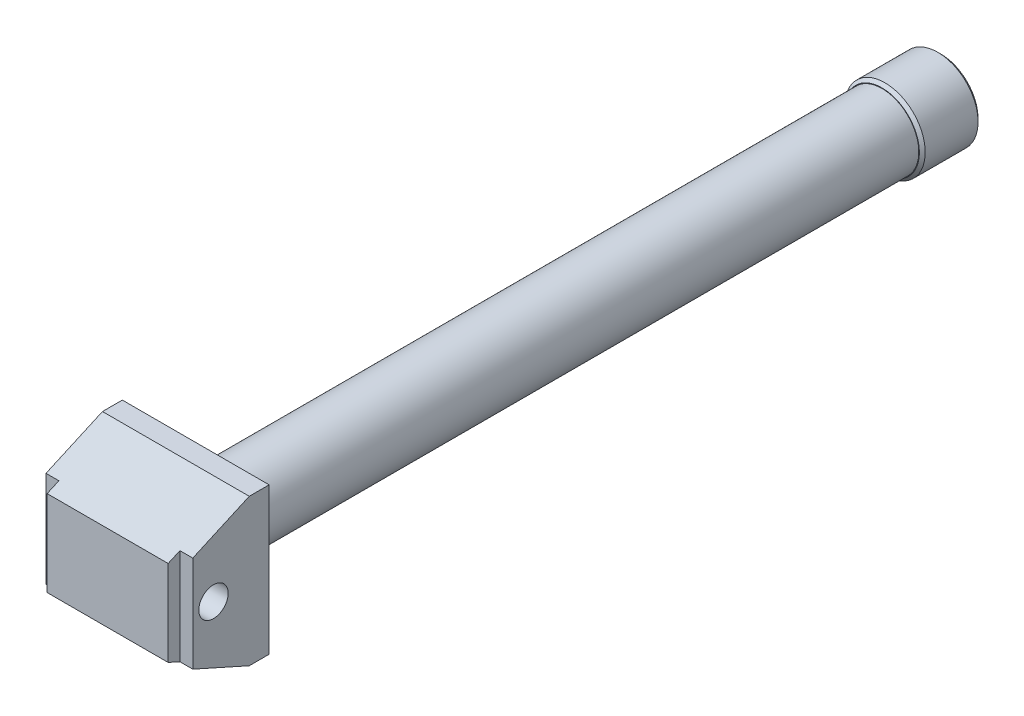
ISO-10303-21;
HEADER;
FILE_DESCRIPTION(('STEP AP214'),'2;1');
FILE_NAME('part.step','',(''),(''),'','','');
FILE_SCHEMA(('AUTOMOTIVE_DESIGN { 1 0 10303 214 1 1 1 1 }'));
ENDSEC;
DATA;
#1=APPLICATION_CONTEXT('core data for automotive mechanical design processes');
#2=APPLICATION_PROTOCOL_DEFINITION('international standard','automotive_design',2000,#1);
#3=PRODUCT_CONTEXT('',#1,'mechanical');
#4=PRODUCT('Part','Part','',(#3));
#5=PRODUCT_RELATED_PRODUCT_CATEGORY('part','',(#4));
#6=PRODUCT_DEFINITION_FORMATION('','',#4);
#7=PRODUCT_DEFINITION_CONTEXT('part definition',#1,'design');
#8=PRODUCT_DEFINITION('design','',#6,#7);
#9=PRODUCT_DEFINITION_SHAPE('','',#8);
#10=(LENGTH_UNIT() NAMED_UNIT(*) SI_UNIT(.MILLI.,.METRE.));
#11=(NAMED_UNIT(*) PLANE_ANGLE_UNIT() SI_UNIT($,.RADIAN.));
#12=(NAMED_UNIT(*) SI_UNIT($,.STERADIAN.) SOLID_ANGLE_UNIT());
#13=UNCERTAINTY_MEASURE_WITH_UNIT(LENGTH_MEASURE(1.E-05),#10,'distance_accuracy_value','');
#14=(GEOMETRIC_REPRESENTATION_CONTEXT(3) GLOBAL_UNCERTAINTY_ASSIGNED_CONTEXT((#13)) GLOBAL_UNIT_ASSIGNED_CONTEXT((#10,
#11,#12)) REPRESENTATION_CONTEXT('',''));
#15=CARTESIAN_POINT('',(0.,0.,0.));
#16=DIRECTION('',(0.,0.,1.));
#17=DIRECTION('',(1.,0.,0.));
#18=AXIS2_PLACEMENT_3D('',#15,#16,#17);
#19=CARTESIAN_POINT('',(0.,0.,-1169.));
#20=DIRECTION('',(0.,0.,-1.));
#21=DIRECTION('',(-1.,0.,0.));
#22=AXIS2_PLACEMENT_3D('',#19,#20,#21);
#23=CYLINDRICAL_SURFACE('',#22,68.445);
#24=CARTESIAN_POINT('',(0.,0.,-1174.));
#25=DIRECTION('',(0.,0.,-1.));
#26=DIRECTION('',(-1.,0.,0.));
#27=AXIS2_PLACEMENT_3D('',#24,#25,#26);
#28=CIRCLE('',#27,68.445);
#29=CARTESIAN_POINT('',(-68.445,0.,-1174.));
#30=VERTEX_POINT('',#29);
#31=EDGE_CURVE('E67',#30,#30,#28,.T.);
#32=ORIENTED_EDGE('',*,*,#31,.T.);
#33=EDGE_LOOP('',(#32));
#34=FACE_BOUND('',#33,.T.);
#35=CARTESIAN_POINT('',(0.,0.,-1264.));
#36=DIRECTION('',(0.,0.,-1.));
#37=DIRECTION('',(-1.,0.,0.));
#38=AXIS2_PLACEMENT_3D('',#35,#36,#37);
#39=CIRCLE('',#38,68.445);
#40=CARTESIAN_POINT('',(-68.445,0.,-1264.));
#41=VERTEX_POINT('',#40);
#42=EDGE_CURVE('E71',#41,#41,#39,.F.);
#43=ORIENTED_EDGE('',*,*,#42,.T.);
#44=EDGE_LOOP('',(#43));
#45=FACE_BOUND('',#44,.T.);
#46=ADVANCED_FACE('F55',(#34,#45),#23,.T.);
#47=CARTESIAN_POINT('',(0.,0.,-1169.));
#48=DIRECTION('',(0.,0.,-1.));
#49=DIRECTION('',(-1.,0.,0.));
#50=AXIS2_PLACEMENT_3D('',#47,#48,#49);
#51=PLANE('',#50);
#52=CARTESIAN_POINT('',(0.,0.,-1169.));
#53=DIRECTION('',(0.,0.,-1.));
#54=DIRECTION('',(-1.,0.,0.));
#55=AXIS2_PLACEMENT_3D('',#52,#53,#54);
#56=CIRCLE('',#55,63.445);
#57=CARTESIAN_POINT('',(-63.445,0.,-1169.));
#58=VERTEX_POINT('',#57);
#59=EDGE_CURVE('E63',#58,#58,#56,.F.);
#60=ORIENTED_EDGE('',*,*,#59,.T.);
#61=EDGE_LOOP('',(#60));
#62=FACE_BOUND('',#61,.T.);
#63=CARTESIAN_POINT('',(0.,0.,-1169.));
#64=DIRECTION('',(0.,0.,-1.));
#65=DIRECTION('',(-1.,0.,0.));
#66=AXIS2_PLACEMENT_3D('',#63,#64,#65);
#67=CIRCLE('',#66,62.5);
#68=CARTESIAN_POINT('',(-62.5,0.,-1169.));
#69=VERTEX_POINT('',#68);
#70=EDGE_CURVE('E76',#69,#69,#67,.T.);
#71=ORIENTED_EDGE('',*,*,#70,.T.);
#72=EDGE_LOOP('',(#71));
#73=FACE_BOUND('',#72,.T.);
#74=ADVANCED_FACE('F83',(#62,#73),#51,.F.);
#75=CARTESIAN_POINT('',(0.,0.,-1269.));
#76=DIRECTION('',(0.,0.,-1.));
#77=DIRECTION('',(-1.,0.,0.));
#78=AXIS2_PLACEMENT_3D('',#75,#76,#77);
#79=PLANE('',#78);
#80=CARTESIAN_POINT('',(0.,0.,-1269.));
#81=DIRECTION('',(0.,0.,-1.));
#82=DIRECTION('',(-1.,0.,0.));
#83=AXIS2_PLACEMENT_3D('',#80,#81,#82);
#84=CIRCLE('',#83,63.4450000000002);
#85=CARTESIAN_POINT('',(-63.4450000000002,0.,-1269.));
#86=VERTEX_POINT('',#85);
#87=EDGE_CURVE('E11',#86,#86,#84,.T.);
#88=ORIENTED_EDGE('',*,*,#87,.T.);
#89=EDGE_LOOP('',(#88));
#90=FACE_BOUND('',#89,.T.);
#91=CARTESIAN_POINT('',(0.,0.,-1269.));
#92=DIRECTION('',(0.,0.,-1.));
#93=DIRECTION('',(-1.,0.,0.));
#94=AXIS2_PLACEMENT_3D('',#91,#92,#93);
#95=CIRCLE('',#94,62.5);
#96=CARTESIAN_POINT('',(-62.5,0.,-1269.));
#97=VERTEX_POINT('',#96);
#98=EDGE_CURVE('E77',#97,#97,#95,.T.);
#99=ORIENTED_EDGE('',*,*,#98,.F.);
#100=EDGE_LOOP('',(#99));
#101=FACE_BOUND('',#100,.T.);
#102=ADVANCED_FACE('F89',(#90,#101),#79,.T.);
#103=CARTESIAN_POINT('',(0.,0.,-1169.));
#104=DIRECTION('',(0.,0.,-1.));
#105=DIRECTION('',(-1.,0.,0.));
#106=AXIS2_PLACEMENT_3D('',#103,#104,#105);
#107=CYLINDRICAL_SURFACE('',#106,62.5);
#108=ORIENTED_EDGE('',*,*,#70,.F.);
#109=EDGE_LOOP('',(#108));
#110=FACE_BOUND('',#109,.T.);
#111=ORIENTED_EDGE('',*,*,#98,.T.);
#112=EDGE_LOOP('',(#111));
#113=FACE_BOUND('',#112,.T.);
#114=ADVANCED_FACE('F85',(#110,#113),#107,.F.);
#115=CARTESIAN_POINT('',(0.,0.,-1174.));
#116=DIRECTION('',(0.,0.,-1.));
#117=DIRECTION('',(-1.,0.,0.));
#118=AXIS2_PLACEMENT_3D('',#115,#116,#117);
#119=CONICAL_SURFACE('',#118,68.445,0.785398163397432);
#120=ORIENTED_EDGE('',*,*,#59,.F.);
#121=EDGE_LOOP('',(#120));
#122=FACE_BOUND('',#121,.T.);
#123=ORIENTED_EDGE('',*,*,#31,.F.);
#124=EDGE_LOOP('',(#123));
#125=FACE_BOUND('',#124,.T.);
#126=ADVANCED_FACE('F88',(#122,#125),#119,.T.);
#127=CARTESIAN_POINT('',(0.,0.,-1269.));
#128=DIRECTION('',(0.,0.,1.));
#129=DIRECTION('',(1.,0.,0.));
#130=AXIS2_PLACEMENT_3D('',#127,#128,#129);
#131=CONICAL_SURFACE('',#130,63.4450000000002,0.785398163397461);
#132=ORIENTED_EDGE('',*,*,#42,.F.);
#133=EDGE_LOOP('',(#132));
#134=FACE_BOUND('',#133,.T.);
#135=ORIENTED_EDGE('',*,*,#87,.F.);
#136=EDGE_LOOP('',(#135));
#137=FACE_BOUND('',#136,.T.);
#138=ADVANCED_FACE('F58',(#134,#137),#131,.T.);
#139=CLOSED_SHELL('',(#46,#74,#102,#114,#126,#138));
#140=MANIFOLD_SOLID_BREP('B2',#139);
#141=CARTESIAN_POINT('',(125.,-125.,150.));
#142=DIRECTION('',(-1.,0.,0.));
#143=DIRECTION('',(0.,0.,1.));
#144=AXIS2_PLACEMENT_3D('',#141,#142,#143);
#145=PLANE('',#144);
#146=CARTESIAN_POINT('',(125.,0.,94.75));
#147=DIRECTION('',(-1.,0.,0.));
#148=DIRECTION('',(0.,0.,1.));
#149=AXIS2_PLACEMENT_3D('',#146,#147,#148);
#150=CIRCLE('',#149,25.);
#151=CARTESIAN_POINT('',(125.,0.,119.75));
#152=VERTEX_POINT('',#151);
#153=EDGE_CURVE('E409',#152,#152,#150,.T.);
#154=ORIENTED_EDGE('',*,*,#153,.T.);
#155=EDGE_LOOP('',(#154));
#156=FACE_BOUND('',#155,.T.);
#157=DIRECTION('',(0.,1.,0.));
#158=VECTOR('',#157,1.);
#159=CARTESIAN_POINT('',(125.,-125.,130.));
#160=LINE('',#159,#158);
#161=CARTESIAN_POINT('',(125.,-81.9516267860216,130.));
#162=VERTEX_POINT('',#161);
#163=CARTESIAN_POINT('',(125.,81.9516267860217,130.));
#164=VERTEX_POINT('',#163);
#165=EDGE_CURVE('E190',#162,#164,#160,.T.);
#166=ORIENTED_EDGE('',*,*,#165,.F.);
#167=DIRECTION('',(0.,-0.408527985139036,-0.912745794489484));
#168=VECTOR('',#167,1.);
#169=CARTESIAN_POINT('',(125.,-81.6785459613715,130.61012558092));
#170=LINE('',#169,#168);
#171=CARTESIAN_POINT('',(125.,-125.,33.82));
#172=VERTEX_POINT('',#171);
#173=EDGE_CURVE('E402',#162,#172,#170,.T.);
#174=ORIENTED_EDGE('',*,*,#173,.T.);
#175=DIRECTION('',(0.,0.,-1.));
#176=VECTOR('',#175,1.);
#177=CARTESIAN_POINT('',(125.,-125.,150.));
#178=LINE('',#177,#176);
#179=CARTESIAN_POINT('',(125.,-125.,0.));
#180=VERTEX_POINT('',#179);
#181=EDGE_CURVE('E432',#172,#180,#178,.T.);
#182=ORIENTED_EDGE('',*,*,#181,.T.);
#183=DIRECTION('',(0.,1.,0.));
#184=VECTOR('',#183,1.);
#185=CARTESIAN_POINT('',(125.,-125.,0.));
#186=LINE('',#185,#184);
#187=CARTESIAN_POINT('',(125.,125.,0.));
#188=VERTEX_POINT('',#187);
#189=EDGE_CURVE('E415',#180,#188,#186,.T.);
#190=ORIENTED_EDGE('',*,*,#189,.T.);
#191=DIRECTION('',(0.,0.,-1.));
#192=VECTOR('',#191,1.);
#193=CARTESIAN_POINT('',(125.,125.,150.));
#194=LINE('',#193,#192);
#195=CARTESIAN_POINT('',(125.,125.,33.82));
#196=VERTEX_POINT('',#195);
#197=EDGE_CURVE('E281',#196,#188,#194,.T.);
#198=ORIENTED_EDGE('',*,*,#197,.F.);
#199=DIRECTION('',(0.,-0.408527985139035,0.912745794489485));
#200=VECTOR('',#199,1.);
#201=CARTESIAN_POINT('',(125.,39.9547673009315,223.83067567265));
#202=LINE('',#201,#200);
#203=EDGE_CURVE('E405',#196,#164,#202,.T.);
#204=ORIENTED_EDGE('',*,*,#203,.T.);
#205=EDGE_LOOP('',(#166,#174,#182,#190,#198,#204));
#206=FACE_BOUND('',#205,.T.);
#207=ADVANCED_FACE('F165',(#156,#206),#145,.F.);
#208=CARTESIAN_POINT('',(0.,0.,150.));
#209=DIRECTION('',(0.,0.,-1.));
#210=DIRECTION('',(-1.,0.,0.));
#211=AXIS2_PLACEMENT_3D('',#208,#209,#210);
#212=PLANE('',#211);
#213=DIRECTION('',(0.,-1.,0.));
#214=VECTOR('',#213,1.);
#215=CARTESIAN_POINT('',(-103.06,191.218693311635,150.));
#216=LINE('',#215,#214);
#217=CARTESIAN_POINT('',(-103.06,73.,150.));
#218=VERTEX_POINT('',#217);
#219=CARTESIAN_POINT('',(-103.06,-72.9999999999999,150.));
#220=VERTEX_POINT('',#219);
#221=EDGE_CURVE('E256',#218,#220,#216,.T.);
#222=ORIENTED_EDGE('',*,*,#221,.T.);
#223=DIRECTION('',(1.,0.,0.));
#224=VECTOR('',#223,1.);
#225=CARTESIAN_POINT('',(0.,-73.,150.));
#226=LINE('',#225,#224);
#227=CARTESIAN_POINT('',(103.06,-73.,150.));
#228=VERTEX_POINT('',#227);
#229=EDGE_CURVE('E264',#220,#228,#226,.T.);
#230=ORIENTED_EDGE('',*,*,#229,.T.);
#231=DIRECTION('',(0.,1.,0.));
#232=VECTOR('',#231,1.);
#233=CARTESIAN_POINT('',(103.06,-159.409156428027,150.));
#234=LINE('',#233,#232);
#235=CARTESIAN_POINT('',(103.06,73.,150.));
#236=VERTEX_POINT('',#235);
#237=EDGE_CURVE('E243',#228,#236,#234,.T.);
#238=ORIENTED_EDGE('',*,*,#237,.T.);
#239=DIRECTION('',(-1.,0.,0.));
#240=VECTOR('',#239,1.);
#241=CARTESIAN_POINT('',(0.,73.,150.));
#242=LINE('',#241,#240);
#243=EDGE_CURVE('E273',#236,#218,#242,.T.);
#244=ORIENTED_EDGE('',*,*,#243,.T.);
#245=EDGE_LOOP('',(#222,#230,#238,#244));
#246=FACE_BOUND('',#245,.T.);
#247=ADVANCED_FACE('F271',(#246),#212,.F.);
#248=CARTESIAN_POINT('',(1144.,-73.,150.));
#249=DIRECTION('',(0.,0.912745794489484,-0.408527985139036));
#250=DIRECTION('',(0.,0.408527985139036,0.912745794489484));
#251=AXIS2_PLACEMENT_3D('',#248,#249,#250);
#252=PLANE('',#251);
#253=DIRECTION('',(0.,0.408527985139036,0.912745794489484));
#254=VECTOR('',#253,1.);
#255=CARTESIAN_POINT('',(-103.06,-73.,150.));
#256=LINE('',#255,#254);
#257=CARTESIAN_POINT('',(-103.06,-81.9516267860217,130.));
#258=VERTEX_POINT('',#257);
#259=EDGE_CURVE('E370',#258,#220,#256,.T.);
#260=ORIENTED_EDGE('',*,*,#259,.F.);
#261=DIRECTION('',(-1.,0.,0.));
#262=VECTOR('',#261,1.);
#263=CARTESIAN_POINT('',(1144.,-81.9516267860216,130.));
#264=LINE('',#263,#262);
#265=CARTESIAN_POINT('',(-125.,-81.9516267860216,130.));
#266=VERTEX_POINT('',#265);
#267=EDGE_CURVE('E375',#258,#266,#264,.T.);
#268=ORIENTED_EDGE('',*,*,#267,.T.);
#269=DIRECTION('',(0.,-0.408527985139036,-0.912745794489484));
#270=VECTOR('',#269,1.);
#271=CARTESIAN_POINT('',(-125.,-73.,150.));
#272=LINE('',#271,#270);
#273=CARTESIAN_POINT('',(-125.,-125.,33.82));
#274=VERTEX_POINT('',#273);
#275=EDGE_CURVE('E389',#266,#274,#272,.T.);
#276=ORIENTED_EDGE('',*,*,#275,.T.);
#277=DIRECTION('',(-1.,0.,0.));
#278=VECTOR('',#277,1.);
#279=CARTESIAN_POINT('',(1144.,-125.,33.82));
#280=LINE('',#279,#278);
#281=EDGE_CURVE('E385',#172,#274,#280,.T.);
#282=ORIENTED_EDGE('',*,*,#281,.F.);
#283=ORIENTED_EDGE('',*,*,#173,.F.);
#284=DIRECTION('',(1.,0.,0.));
#285=VECTOR('',#284,1.);
#286=CARTESIAN_POINT('',(1144.,-81.9516267860216,130.));
#287=LINE('',#286,#285);
#288=CARTESIAN_POINT('',(103.06,-81.9516267860216,130.));
#289=VERTEX_POINT('',#288);
#290=EDGE_CURVE('E266',#289,#162,#287,.T.);
#291=ORIENTED_EDGE('',*,*,#290,.F.);
#292=DIRECTION('',(0.,-0.408527985139036,-0.912745794489484));
#293=VECTOR('',#292,1.);
#294=CARTESIAN_POINT('',(103.06,-73.,150.));
#295=LINE('',#294,#293);
#296=EDGE_CURVE('E247',#228,#289,#295,.T.);
#297=ORIENTED_EDGE('',*,*,#296,.F.);
#298=ORIENTED_EDGE('',*,*,#229,.F.);
#299=EDGE_LOOP('',(#260,#268,#276,#282,#283,#291,#297,#298));
#300=FACE_BOUND('',#299,.T.);
#301=ADVANCED_FACE('F263',(#300),#252,.F.);
#302=CARTESIAN_POINT('',(1144.,73.,150.));
#303=DIRECTION('',(0.,-0.912745794489484,-0.408527985139035));
#304=DIRECTION('',(0.,0.408527985139035,-0.912745794489485));
#305=AXIS2_PLACEMENT_3D('',#302,#303,#304);
#306=PLANE('',#305);
#307=DIRECTION('',(0.,0.408527985139035,-0.912745794489485));
#308=VECTOR('',#307,1.);
#309=CARTESIAN_POINT('',(-103.06,73.,150.));
#310=LINE('',#309,#308);
#311=CARTESIAN_POINT('',(-103.06,81.9516267860217,130.));
#312=VERTEX_POINT('',#311);
#313=EDGE_CURVE('E294',#218,#312,#310,.T.);
#314=ORIENTED_EDGE('',*,*,#313,.F.);
#315=ORIENTED_EDGE('',*,*,#243,.F.);
#316=DIRECTION('',(0.,-0.408527985139035,0.912745794489485));
#317=VECTOR('',#316,1.);
#318=CARTESIAN_POINT('',(103.06,73.,150.));
#319=LINE('',#318,#317);
#320=CARTESIAN_POINT('',(103.06,81.9516267860217,130.));
#321=VERTEX_POINT('',#320);
#322=EDGE_CURVE('E250',#321,#236,#319,.T.);
#323=ORIENTED_EDGE('',*,*,#322,.F.);
#324=DIRECTION('',(-1.,0.,0.));
#325=VECTOR('',#324,1.);
#326=CARTESIAN_POINT('',(1144.,81.9516267860217,130.));
#327=LINE('',#326,#325);
#328=EDGE_CURVE('E278',#164,#321,#327,.T.);
#329=ORIENTED_EDGE('',*,*,#328,.F.);
#330=ORIENTED_EDGE('',*,*,#203,.F.);
#331=DIRECTION('',(-1.,0.,0.));
#332=VECTOR('',#331,1.);
#333=CARTESIAN_POINT('',(1144.,125.,33.82));
#334=LINE('',#333,#332);
#335=CARTESIAN_POINT('',(-125.,125.,33.82));
#336=VERTEX_POINT('',#335);
#337=EDGE_CURVE('E380',#196,#336,#334,.T.);
#338=ORIENTED_EDGE('',*,*,#337,.T.);
#339=DIRECTION('',(0.,-0.408527985139035,0.912745794489484));
#340=VECTOR('',#339,1.);
#341=CARTESIAN_POINT('',(-125.,73.,150.));
#342=LINE('',#341,#340);
#343=CARTESIAN_POINT('',(-125.,81.9516267860217,130.));
#344=VERTEX_POINT('',#343);
#345=EDGE_CURVE('E390',#336,#344,#342,.T.);
#346=ORIENTED_EDGE('',*,*,#345,.T.);
#347=DIRECTION('',(1.,0.,0.));
#348=VECTOR('',#347,1.);
#349=CARTESIAN_POINT('',(1144.,81.9516267860217,130.));
#350=LINE('',#349,#348);
#351=EDGE_CURVE('E290',#344,#312,#350,.T.);
#352=ORIENTED_EDGE('',*,*,#351,.T.);
#353=EDGE_LOOP('',(#314,#315,#323,#329,#330,#338,#346,#352));
#354=FACE_BOUND('',#353,.T.);
#355=ADVANCED_FACE('F325',(#354),#306,.F.);
#356=CARTESIAN_POINT('',(-125.,125.,150.));
#357=DIRECTION('',(0.,-1.,0.));
#358=DIRECTION('',(0.,0.,-1.));
#359=AXIS2_PLACEMENT_3D('',#356,#357,#358);
#360=PLANE('',#359);
#361=DIRECTION('',(0.,0.,-1.));
#362=VECTOR('',#361,1.);
#363=CARTESIAN_POINT('',(-125.,125.,150.));
#364=LINE('',#363,#362);
#365=CARTESIAN_POINT('',(-125.,125.,0.));
#366=VERTEX_POINT('',#365);
#367=EDGE_CURVE('E437',#336,#366,#364,.T.);
#368=ORIENTED_EDGE('',*,*,#367,.F.);
#369=ORIENTED_EDGE('',*,*,#337,.F.);
#370=ORIENTED_EDGE('',*,*,#197,.T.);
#371=DIRECTION('',(-1.,0.,0.));
#372=VECTOR('',#371,1.);
#373=CARTESIAN_POINT('',(-125.,125.,0.));
#374=LINE('',#373,#372);
#375=EDGE_CURVE('E420',#188,#366,#374,.T.);
#376=ORIENTED_EDGE('',*,*,#375,.T.);
#377=EDGE_LOOP('',(#368,#369,#370,#376));
#378=FACE_BOUND('',#377,.T.);
#379=ADVANCED_FACE('F321',(#378),#360,.F.);
#380=CARTESIAN_POINT('',(-125.,-125.,150.));
#381=DIRECTION('',(1.,0.,0.));
#382=DIRECTION('',(0.,0.,-1.));
#383=AXIS2_PLACEMENT_3D('',#380,#381,#382);
#384=PLANE('',#383);
#385=CARTESIAN_POINT('',(-125.,0.,94.75));
#386=DIRECTION('',(-1.,0.,0.));
#387=DIRECTION('',(0.,0.,1.));
#388=AXIS2_PLACEMENT_3D('',#385,#386,#387);
#389=CIRCLE('',#388,25.);
#390=CARTESIAN_POINT('',(-125.,0.,119.75));
#391=VERTEX_POINT('',#390);
#392=EDGE_CURVE('E393',#391,#391,#389,.T.);
#393=ORIENTED_EDGE('',*,*,#392,.F.);
#394=EDGE_LOOP('',(#393));
#395=FACE_BOUND('',#394,.T.);
#396=ORIENTED_EDGE('',*,*,#275,.F.);
#397=DIRECTION('',(0.,1.,0.));
#398=VECTOR('',#397,1.);
#399=CARTESIAN_POINT('',(-125.,-125.,130.));
#400=LINE('',#399,#398);
#401=EDGE_CURVE('E268',#266,#344,#400,.T.);
#402=ORIENTED_EDGE('',*,*,#401,.T.);
#403=ORIENTED_EDGE('',*,*,#345,.F.);
#404=ORIENTED_EDGE('',*,*,#367,.T.);
#405=DIRECTION('',(0.,-1.,0.));
#406=VECTOR('',#405,1.);
#407=CARTESIAN_POINT('',(-125.,-125.,0.));
#408=LINE('',#407,#406);
#409=CARTESIAN_POINT('',(-125.,-125.,0.));
#410=VERTEX_POINT('',#409);
#411=EDGE_CURVE('E424',#366,#410,#408,.T.);
#412=ORIENTED_EDGE('',*,*,#411,.T.);
#413=DIRECTION('',(0.,0.,-1.));
#414=VECTOR('',#413,1.);
#415=CARTESIAN_POINT('',(-125.,-125.,150.));
#416=LINE('',#415,#414);
#417=EDGE_CURVE('E435',#274,#410,#416,.T.);
#418=ORIENTED_EDGE('',*,*,#417,.F.);
#419=EDGE_LOOP('',(#396,#402,#403,#404,#412,#418));
#420=FACE_BOUND('',#419,.T.);
#421=ADVANCED_FACE('F324',(#395,#420),#384,.F.);
#422=CARTESIAN_POINT('',(-125.,-125.,150.));
#423=DIRECTION('',(0.,1.,0.));
#424=DIRECTION('',(0.,0.,1.));
#425=AXIS2_PLACEMENT_3D('',#422,#423,#424);
#426=PLANE('',#425);
#427=ORIENTED_EDGE('',*,*,#181,.F.);
#428=ORIENTED_EDGE('',*,*,#281,.T.);
#429=ORIENTED_EDGE('',*,*,#417,.T.);
#430=DIRECTION('',(1.,0.,0.));
#431=VECTOR('',#430,1.);
#432=CARTESIAN_POINT('',(-125.,-125.,0.));
#433=LINE('',#432,#431);
#434=EDGE_CURVE('E428',#410,#180,#433,.T.);
#435=ORIENTED_EDGE('',*,*,#434,.T.);
#436=EDGE_LOOP('',(#427,#428,#429,#435));
#437=FACE_BOUND('',#436,.T.);
#438=ADVANCED_FACE('F329',(#437),#426,.F.);
#439=CARTESIAN_POINT('',(0.,0.,0.));
#440=DIRECTION('',(0.,0.,-1.));
#441=DIRECTION('',(-1.,0.,0.));
#442=AXIS2_PLACEMENT_3D('',#439,#440,#441);
#443=PLANE('',#442);
#444=CARTESIAN_POINT('',(0.,0.,0.));
#445=DIRECTION('',(0.,0.,-1.));
#446=DIRECTION('',(-1.,0.,0.));
#447=AXIS2_PLACEMENT_3D('',#444,#445,#446);
#448=CIRCLE('',#447,62.5);
#449=CARTESIAN_POINT('',(-62.5,0.,0.));
#450=VERTEX_POINT('',#449);
#451=EDGE_CURVE('E274',#450,#450,#448,.T.);
#452=ORIENTED_EDGE('',*,*,#451,.F.);
#453=EDGE_LOOP('',(#452));
#454=FACE_BOUND('',#453,.T.);
#455=ORIENTED_EDGE('',*,*,#189,.F.);
#456=ORIENTED_EDGE('',*,*,#434,.F.);
#457=ORIENTED_EDGE('',*,*,#411,.F.);
#458=ORIENTED_EDGE('',*,*,#375,.F.);
#459=EDGE_LOOP('',(#455,#456,#457,#458));
#460=FACE_BOUND('',#459,.T.);
#461=ADVANCED_FACE('F333',(#454,#460),#443,.T.);
#462=CARTESIAN_POINT('',(0.,0.,-1269.));
#463=DIRECTION('',(0.,0.,1.));
#464=DIRECTION('',(1.,0.,0.));
#465=AXIS2_PLACEMENT_3D('',#462,#463,#464);
#466=CYLINDRICAL_SURFACE('',#465,62.5);
#467=CARTESIAN_POINT('',(0.,0.,-1269.));
#468=DIRECTION('',(0.,0.,-1.));
#469=DIRECTION('',(-1.,0.,0.));
#470=AXIS2_PLACEMENT_3D('',#467,#468,#469);
#471=CIRCLE('',#470,62.5);
#472=CARTESIAN_POINT('',(-62.5,0.,-1269.));
#473=VERTEX_POINT('',#472);
#474=EDGE_CURVE('E412',#473,#473,#471,.T.);
#475=ORIENTED_EDGE('',*,*,#474,.F.);
#476=EDGE_LOOP('',(#475));
#477=FACE_BOUND('',#476,.T.);
#478=ORIENTED_EDGE('',*,*,#451,.T.);
#479=EDGE_LOOP('',(#478));
#480=FACE_BOUND('',#479,.T.);
#481=ADVANCED_FACE('F336',(#477,#480),#466,.T.);
#482=CARTESIAN_POINT('',(0.,0.,-1269.));
#483=DIRECTION('',(0.,0.,-1.));
#484=DIRECTION('',(-1.,0.,0.));
#485=AXIS2_PLACEMENT_3D('',#482,#483,#484);
#486=PLANE('',#485);
#487=CARTESIAN_POINT('',(0.,0.,-1269.));
#488=DIRECTION('',(0.,0.,-1.));
#489=DIRECTION('',(-1.,0.,0.));
#490=AXIS2_PLACEMENT_3D('',#487,#488,#489);
#491=CIRCLE('',#490,42.4999999999998);
#492=CARTESIAN_POINT('',(-42.4999999999998,0.,-1269.));
#493=VERTEX_POINT('',#492);
#494=EDGE_CURVE('E53',#493,#493,#491,.F.);
#495=ORIENTED_EDGE('',*,*,#494,.T.);
#496=EDGE_LOOP('',(#495));
#497=FACE_BOUND('',#496,.T.);
#498=ORIENTED_EDGE('',*,*,#474,.T.);
#499=EDGE_LOOP('',(#498));
#500=FACE_BOUND('',#499,.T.);
#501=ADVANCED_FACE('F341',(#497,#500),#486,.T.);
#502=CARTESIAN_POINT('',(1144.,0.,94.75));
#503=DIRECTION('',(-1.,0.,0.));
#504=DIRECTION('',(0.,0.,1.));
#505=AXIS2_PLACEMENT_3D('',#502,#503,#504);
#506=CYLINDRICAL_SURFACE('',#505,25.);
#507=ORIENTED_EDGE('',*,*,#392,.T.);
#508=EDGE_LOOP('',(#507));
#509=FACE_BOUND('',#508,.T.);
#510=ORIENTED_EDGE('',*,*,#153,.F.);
#511=EDGE_LOOP('',(#510));
#512=FACE_BOUND('',#511,.T.);
#513=ADVANCED_FACE('F345',(#509,#512),#506,.F.);
#514=CARTESIAN_POINT('',(0.,0.,106.066017177982));
#515=DIRECTION('',(0.,0.,-1.));
#516=DIRECTION('',(-1.,0.,0.));
#517=AXIS2_PLACEMENT_3D('',#514,#515,#516);
#518=CYLINDRICAL_SURFACE('',#517,37.5);
#519=CARTESIAN_POINT('',(0.,0.,-1264.));
#520=DIRECTION('',(0.,0.,-1.));
#521=DIRECTION('',(-1.,0.,0.));
#522=AXIS2_PLACEMENT_3D('',#519,#520,#521);
#523=CIRCLE('',#522,37.5);
#524=CARTESIAN_POINT('',(-37.5,0.,-1264.));
#525=VERTEX_POINT('',#524);
#526=EDGE_CURVE('E175',#525,#525,#523,.T.);
#527=ORIENTED_EDGE('',*,*,#526,.T.);
#528=EDGE_LOOP('',(#527));
#529=FACE_BOUND('',#528,.T.);
#530=CARTESIAN_POINT('',(0.,0.,0.));
#531=DIRECTION('',(0.,0.,-1.));
#532=DIRECTION('',(-1.,0.,0.));
#533=AXIS2_PLACEMENT_3D('',#530,#531,#532);
#534=CIRCLE('',#533,37.5);
#535=CARTESIAN_POINT('',(-37.5,0.,0.));
#536=VERTEX_POINT('',#535);
#537=EDGE_CURVE('E374',#536,#536,#534,.F.);
#538=ORIENTED_EDGE('',*,*,#537,.T.);
#539=EDGE_LOOP('',(#538));
#540=FACE_BOUND('',#539,.T.);
#541=ADVANCED_FACE('F300',(#529,#540),#518,.F.);
#542=CARTESIAN_POINT('',(0.,0.,0.));
#543=DIRECTION('',(0.,0.,-1.));
#544=DIRECTION('',(-1.,0.,0.));
#545=AXIS2_PLACEMENT_3D('',#542,#543,#544);
#546=PLANE('',#545);
#547=ORIENTED_EDGE('',*,*,#537,.F.);
#548=EDGE_LOOP('',(#547));
#549=FACE_BOUND('',#548,.T.);
#550=ADVANCED_FACE('F357',(#549),#546,.T.);
#551=CARTESIAN_POINT('',(103.06,-159.409156428027,130.));
#552=DIRECTION('',(1.,0.,0.));
#553=DIRECTION('',(0.,0.,-1.));
#554=AXIS2_PLACEMENT_3D('',#551,#552,#553);
#555=PLANE('',#554);
#556=ORIENTED_EDGE('',*,*,#296,.T.);
#557=DIRECTION('',(0.,1.,0.));
#558=VECTOR('',#557,1.);
#559=CARTESIAN_POINT('',(103.06,-159.409156428027,130.));
#560=LINE('',#559,#558);
#561=EDGE_CURVE('E257',#289,#321,#560,.T.);
#562=ORIENTED_EDGE('',*,*,#561,.T.);
#563=ORIENTED_EDGE('',*,*,#322,.T.);
#564=ORIENTED_EDGE('',*,*,#237,.F.);
#565=EDGE_LOOP('',(#556,#562,#563,#564));
#566=FACE_BOUND('',#565,.T.);
#567=ADVANCED_FACE('F245',(#566),#555,.T.);
#568=CARTESIAN_POINT('',(0.,0.,130.));
#569=DIRECTION('',(0.,0.,1.));
#570=DIRECTION('',(1.,0.,0.));
#571=AXIS2_PLACEMENT_3D('',#568,#569,#570);
#572=PLANE('',#571);
#573=ORIENTED_EDGE('',*,*,#290,.T.);
#574=ORIENTED_EDGE('',*,*,#165,.T.);
#575=ORIENTED_EDGE('',*,*,#328,.T.);
#576=ORIENTED_EDGE('',*,*,#561,.F.);
#577=EDGE_LOOP('',(#573,#574,#575,#576));
#578=FACE_BOUND('',#577,.T.);
#579=ADVANCED_FACE('F361',(#578),#572,.T.);
#580=CARTESIAN_POINT('',(-103.06,191.218693311635,130.));
#581=DIRECTION('',(-1.,0.,0.));
#582=DIRECTION('',(0.,-1.,0.));
#583=AXIS2_PLACEMENT_3D('',#580,#581,#582);
#584=PLANE('',#583);
#585=ORIENTED_EDGE('',*,*,#259,.T.);
#586=ORIENTED_EDGE('',*,*,#221,.F.);
#587=ORIENTED_EDGE('',*,*,#313,.T.);
#588=DIRECTION('',(0.,-1.,0.));
#589=VECTOR('',#588,1.);
#590=CARTESIAN_POINT('',(-103.06,191.218693311635,130.));
#591=LINE('',#590,#589);
#592=EDGE_CURVE('E182',#312,#258,#591,.T.);
#593=ORIENTED_EDGE('',*,*,#592,.T.);
#594=EDGE_LOOP('',(#585,#586,#587,#593));
#595=FACE_BOUND('',#594,.T.);
#596=ADVANCED_FACE('F309',(#595),#584,.T.);
#597=CARTESIAN_POINT('',(0.,0.,130.));
#598=DIRECTION('',(0.,0.,-1.));
#599=DIRECTION('',(-1.,0.,0.));
#600=AXIS2_PLACEMENT_3D('',#597,#598,#599);
#601=PLANE('',#600);
#602=ORIENTED_EDGE('',*,*,#592,.F.);
#603=ORIENTED_EDGE('',*,*,#351,.F.);
#604=ORIENTED_EDGE('',*,*,#401,.F.);
#605=ORIENTED_EDGE('',*,*,#267,.F.);
#606=EDGE_LOOP('',(#602,#603,#604,#605));
#607=FACE_BOUND('',#606,.T.);
#608=ADVANCED_FACE('F304',(#607),#601,.F.);
#609=CARTESIAN_POINT('',(0.,0.,-1264.));
#610=DIRECTION('',(0.,0.,-1.));
#611=DIRECTION('',(-1.,0.,0.));
#612=AXIS2_PLACEMENT_3D('',#609,#610,#611);
#613=CONICAL_SURFACE('',#612,37.5,0.785398163397434);
#614=ORIENTED_EDGE('',*,*,#494,.F.);
#615=EDGE_LOOP('',(#614));
#616=FACE_BOUND('',#615,.T.);
#617=ORIENTED_EDGE('',*,*,#526,.F.);
#618=EDGE_LOOP('',(#617));
#619=FACE_BOUND('',#618,.T.);
#620=ADVANCED_FACE('F168',(#616,#619),#613,.F.);
#621=CLOSED_SHELL('',(#207,#247,#301,#355,#379,#421,#438,#461,#481,#501,#513,#541,#550,#567,
#579,#596,#608,#620));
#622=MANIFOLD_SOLID_BREP('B6',#621);
#623=ADVANCED_BREP_SHAPE_REPRESENTATION('',(#18,#140,#622),#14);
#624=SHAPE_DEFINITION_REPRESENTATION(#9,#623);
ENDSEC;
END-ISO-10303-21;
